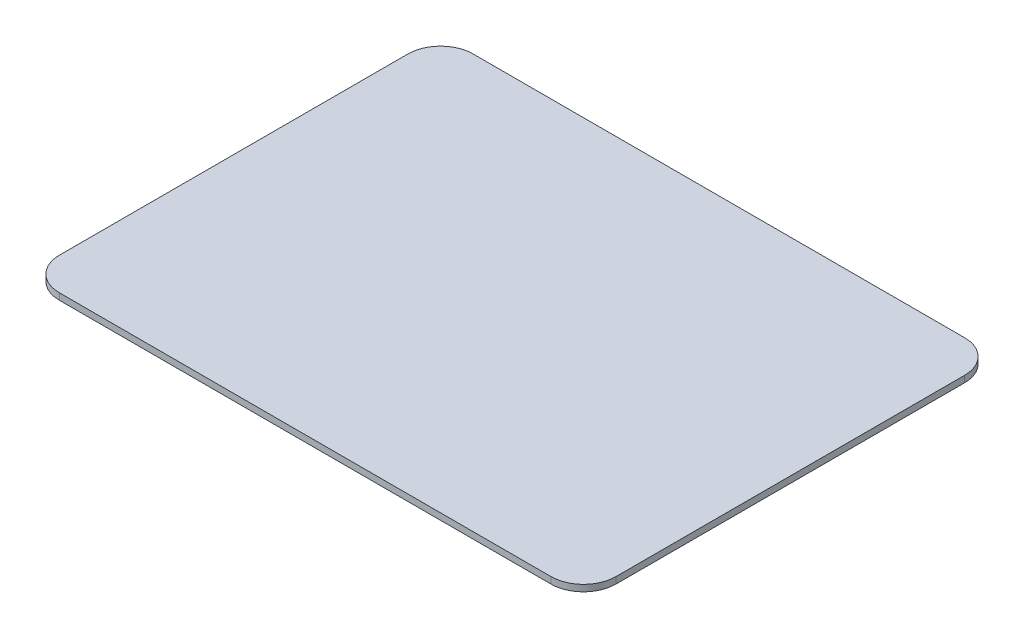
ISO-10303-21;
HEADER;
FILE_DESCRIPTION(('STEP AP214'),'2;1');
FILE_NAME('part.step','',(''),(''),'','','');
FILE_SCHEMA(('AUTOMOTIVE_DESIGN { 1 0 10303 214 1 1 1 1 }'));
ENDSEC;
DATA;
#1=APPLICATION_CONTEXT('core data for automotive mechanical design processes');
#2=APPLICATION_PROTOCOL_DEFINITION('international standard','automotive_design',2000,#1);
#3=PRODUCT_CONTEXT('',#1,'mechanical');
#4=PRODUCT('Part','Part','',(#3));
#5=PRODUCT_RELATED_PRODUCT_CATEGORY('part','',(#4));
#6=PRODUCT_DEFINITION_FORMATION('','',#4);
#7=PRODUCT_DEFINITION_CONTEXT('part definition',#1,'design');
#8=PRODUCT_DEFINITION('design','',#6,#7);
#9=PRODUCT_DEFINITION_SHAPE('','',#8);
#10=(LENGTH_UNIT() NAMED_UNIT(*) SI_UNIT(.MILLI.,.METRE.));
#11=(NAMED_UNIT(*) PLANE_ANGLE_UNIT() SI_UNIT($,.RADIAN.));
#12=(NAMED_UNIT(*) SI_UNIT($,.STERADIAN.) SOLID_ANGLE_UNIT());
#13=UNCERTAINTY_MEASURE_WITH_UNIT(LENGTH_MEASURE(1.E-05),#10,'distance_accuracy_value','');
#14=(GEOMETRIC_REPRESENTATION_CONTEXT(3) GLOBAL_UNCERTAINTY_ASSIGNED_CONTEXT((#13)) GLOBAL_UNIT_ASSIGNED_CONTEXT((#10,
#11,#12)) REPRESENTATION_CONTEXT('',''));
#15=CARTESIAN_POINT('',(0.,0.,0.));
#16=DIRECTION('',(0.,0.,1.));
#17=DIRECTION('',(1.,0.,0.));
#18=AXIS2_PLACEMENT_3D('',#15,#16,#17);
#19=CARTESIAN_POINT('',(20.9358973194442,3.,-141.27613784606));
#20=DIRECTION('',(1.,0.,0.));
#21=DIRECTION('',(0.,0.,-1.));
#22=AXIS2_PLACEMENT_3D('',#19,#20,#21);
#23=PLANE('',#22);
#24=DIRECTION('',(0.,0.,1.));
#25=VECTOR('',#24,1.);
#26=CARTESIAN_POINT('',(20.9358973194442,3.,-141.27613784606));
#27=LINE('',#26,#25);
#28=CARTESIAN_POINT('',(20.9358973194442,3.,-126.27613784606));
#29=VERTEX_POINT('',#28);
#30=CARTESIAN_POINT('',(20.9358973194442,3.,34.2559985482419));
#31=VERTEX_POINT('',#30);
#32=EDGE_CURVE('E130',#29,#31,#27,.T.);
#33=ORIENTED_EDGE('',*,*,#32,.F.);
#34=DIRECTION('',(0.,-1.,0.));
#35=VECTOR('',#34,1.);
#36=CARTESIAN_POINT('',(20.9358973194442,3.,-126.27613784606));
#37=LINE('',#36,#35);
#38=CARTESIAN_POINT('',(20.9358973194442,0.,-126.27613784606));
#39=VERTEX_POINT('',#38);
#40=EDGE_CURVE('E11',#29,#39,#37,.T.);
#41=ORIENTED_EDGE('',*,*,#40,.T.);
#42=DIRECTION('',(0.,0.,1.));
#43=VECTOR('',#42,1.);
#44=CARTESIAN_POINT('',(20.9358973194442,0.,-141.27613784606));
#45=LINE('',#44,#43);
#46=CARTESIAN_POINT('',(20.9358973194442,0.,34.2559985482419));
#47=VERTEX_POINT('',#46);
#48=EDGE_CURVE('E132',#39,#47,#45,.T.);
#49=ORIENTED_EDGE('',*,*,#48,.T.);
#50=DIRECTION('',(0.,-1.,0.));
#51=VECTOR('',#50,1.);
#52=CARTESIAN_POINT('',(20.9358973194442,3.,34.2559985482419));
#53=LINE('',#52,#51);
#54=EDGE_CURVE('E43',#47,#31,#53,.F.);
#55=ORIENTED_EDGE('',*,*,#54,.T.);
#56=EDGE_LOOP('',(#33,#41,#49,#55));
#57=FACE_BOUND('',#56,.T.);
#58=ADVANCED_FACE('F35',(#57),#23,.F.);
#59=CARTESIAN_POINT('',(20.9358973194442,3.,49.2559985482419));
#60=DIRECTION('',(0.,0.,-1.));
#61=DIRECTION('',(-1.,0.,0.));
#62=AXIS2_PLACEMENT_3D('',#59,#60,#61);
#63=PLANE('',#62);
#64=DIRECTION('',(1.,0.,0.));
#65=VECTOR('',#64,1.);
#66=CARTESIAN_POINT('',(20.9358973194442,0.,49.2559985482419));
#67=LINE('',#66,#65);
#68=CARTESIAN_POINT('',(35.9358973194442,0.,49.2559985482419));
#69=VERTEX_POINT('',#68);
#70=CARTESIAN_POINT('',(262.301771029212,0.,49.2559985482419));
#71=VERTEX_POINT('',#70);
#72=EDGE_CURVE('E128',#69,#71,#67,.T.);
#73=ORIENTED_EDGE('',*,*,#72,.T.);
#74=DIRECTION('',(0.,-1.,0.));
#75=VECTOR('',#74,1.);
#76=CARTESIAN_POINT('',(262.301771029212,3.,49.2559985482419));
#77=LINE('',#76,#75);
#78=CARTESIAN_POINT('',(262.301771029212,3.,49.2559985482419));
#79=VERTEX_POINT('',#78);
#80=EDGE_CURVE('E107',#71,#79,#77,.F.);
#81=ORIENTED_EDGE('',*,*,#80,.T.);
#82=DIRECTION('',(1.,0.,0.));
#83=VECTOR('',#82,1.);
#84=CARTESIAN_POINT('',(20.9358973194442,3.,49.2559985482419));
#85=LINE('',#84,#83);
#86=CARTESIAN_POINT('',(35.9358973194442,3.,49.2559985482419));
#87=VERTEX_POINT('',#86);
#88=EDGE_CURVE('E168',#87,#79,#85,.T.);
#89=ORIENTED_EDGE('',*,*,#88,.F.);
#90=DIRECTION('',(0.,-1.,0.));
#91=VECTOR('',#90,1.);
#92=CARTESIAN_POINT('',(35.9358973194442,3.,49.2559985482419));
#93=LINE('',#92,#91);
#94=EDGE_CURVE('E112',#87,#69,#93,.T.);
#95=ORIENTED_EDGE('',*,*,#94,.T.);
#96=EDGE_LOOP('',(#73,#81,#89,#95));
#97=FACE_BOUND('',#96,.T.);
#98=ADVANCED_FACE('F172',(#97),#63,.F.);
#99=CARTESIAN_POINT('',(277.301771029212,3.,-141.27613784606));
#100=DIRECTION('',(-1.,0.,0.));
#101=DIRECTION('',(0.,0.,1.));
#102=AXIS2_PLACEMENT_3D('',#99,#100,#101);
#103=PLANE('',#102);
#104=DIRECTION('',(0.,0.,-1.));
#105=VECTOR('',#104,1.);
#106=CARTESIAN_POINT('',(277.301771029212,3.,-141.27613784606));
#107=LINE('',#106,#105);
#108=CARTESIAN_POINT('',(277.301771029212,3.,34.2559985482419));
#109=VERTEX_POINT('',#108);
#110=CARTESIAN_POINT('',(277.301771029212,3.,-126.27613784606));
#111=VERTEX_POINT('',#110);
#112=EDGE_CURVE('E121',#109,#111,#107,.T.);
#113=ORIENTED_EDGE('',*,*,#112,.F.);
#114=DIRECTION('',(0.,-1.,0.));
#115=VECTOR('',#114,1.);
#116=CARTESIAN_POINT('',(277.301771029212,3.,34.2559985482419));
#117=LINE('',#116,#115);
#118=CARTESIAN_POINT('',(277.301771029212,0.,34.2559985482419));
#119=VERTEX_POINT('',#118);
#120=EDGE_CURVE('E106',#109,#119,#117,.T.);
#121=ORIENTED_EDGE('',*,*,#120,.T.);
#122=DIRECTION('',(0.,0.,-1.));
#123=VECTOR('',#122,1.);
#124=CARTESIAN_POINT('',(277.301771029212,0.,-141.27613784606));
#125=LINE('',#124,#123);
#126=CARTESIAN_POINT('',(277.301771029212,0.,-126.27613784606));
#127=VERTEX_POINT('',#126);
#128=EDGE_CURVE('E119',#119,#127,#125,.T.);
#129=ORIENTED_EDGE('',*,*,#128,.T.);
#130=DIRECTION('',(0.,-1.,0.));
#131=VECTOR('',#130,1.);
#132=CARTESIAN_POINT('',(277.301771029212,3.,-126.27613784606));
#133=LINE('',#132,#131);
#134=EDGE_CURVE('E123',#127,#111,#133,.F.);
#135=ORIENTED_EDGE('',*,*,#134,.T.);
#136=EDGE_LOOP('',(#113,#121,#129,#135));
#137=FACE_BOUND('',#136,.T.);
#138=ADVANCED_FACE('F118',(#137),#103,.F.);
#139=CARTESIAN_POINT('',(20.9358973194442,3.,-141.27613784606));
#140=DIRECTION('',(0.,0.,1.));
#141=DIRECTION('',(1.,0.,0.));
#142=AXIS2_PLACEMENT_3D('',#139,#140,#141);
#143=PLANE('',#142);
#144=DIRECTION('',(-1.,0.,0.));
#145=VECTOR('',#144,1.);
#146=CARTESIAN_POINT('',(20.9358973194442,3.,-141.27613784606));
#147=LINE('',#146,#145);
#148=CARTESIAN_POINT('',(262.301771029212,3.,-141.27613784606));
#149=VERTEX_POINT('',#148);
#150=CARTESIAN_POINT('',(35.9358973194442,3.,-141.27613784606));
#151=VERTEX_POINT('',#150);
#152=EDGE_CURVE('E136',#149,#151,#147,.T.);
#153=ORIENTED_EDGE('',*,*,#152,.F.);
#154=DIRECTION('',(0.,-1.,0.));
#155=VECTOR('',#154,1.);
#156=CARTESIAN_POINT('',(262.301771029212,3.,-141.27613784606));
#157=LINE('',#156,#155);
#158=CARTESIAN_POINT('',(262.301771029212,0.,-141.27613784606));
#159=VERTEX_POINT('',#158);
#160=EDGE_CURVE('E153',#149,#159,#157,.T.);
#161=ORIENTED_EDGE('',*,*,#160,.T.);
#162=DIRECTION('',(-1.,0.,0.));
#163=VECTOR('',#162,1.);
#164=CARTESIAN_POINT('',(20.9358973194442,0.,-141.27613784606));
#165=LINE('',#164,#163);
#166=CARTESIAN_POINT('',(35.9358973194442,0.,-141.27613784606));
#167=VERTEX_POINT('',#166);
#168=EDGE_CURVE('E127',#159,#167,#165,.T.);
#169=ORIENTED_EDGE('',*,*,#168,.T.);
#170=DIRECTION('',(0.,-1.,0.));
#171=VECTOR('',#170,1.);
#172=CARTESIAN_POINT('',(35.9358973194442,3.,-141.27613784606));
#173=LINE('',#172,#171);
#174=EDGE_CURVE('E50',#167,#151,#173,.F.);
#175=ORIENTED_EDGE('',*,*,#174,.T.);
#176=EDGE_LOOP('',(#153,#161,#169,#175));
#177=FACE_BOUND('',#176,.T.);
#178=ADVANCED_FACE('F179',(#177),#143,.F.);
#179=CARTESIAN_POINT('',(0.,3.,0.));
#180=DIRECTION('',(0.,1.,0.));
#181=DIRECTION('',(0.,0.,1.));
#182=AXIS2_PLACEMENT_3D('',#179,#180,#181);
#183=PLANE('',#182);
#184=ORIENTED_EDGE('',*,*,#88,.T.);
#185=CARTESIAN_POINT('',(262.301771029212,3.,34.2559985482419));
#186=DIRECTION('',(0.,1.,0.));
#187=DIRECTION('',(0.,0.,1.));
#188=AXIS2_PLACEMENT_3D('',#185,#186,#187);
#189=CIRCLE('',#188,15.);
#190=EDGE_CURVE('E150',#79,#109,#189,.T.);
#191=ORIENTED_EDGE('',*,*,#190,.T.);
#192=ORIENTED_EDGE('',*,*,#112,.T.);
#193=CARTESIAN_POINT('',(262.301771029212,3.,-126.27613784606));
#194=DIRECTION('',(0.,1.,0.));
#195=DIRECTION('',(0.,0.,1.));
#196=AXIS2_PLACEMENT_3D('',#193,#194,#195);
#197=CIRCLE('',#196,15.);
#198=EDGE_CURVE('E57',#111,#149,#197,.T.);
#199=ORIENTED_EDGE('',*,*,#198,.T.);
#200=ORIENTED_EDGE('',*,*,#152,.T.);
#201=CARTESIAN_POINT('',(35.9358973194442,3.,-126.27613784606));
#202=DIRECTION('',(0.,1.,0.));
#203=DIRECTION('',(0.,0.,1.));
#204=AXIS2_PLACEMENT_3D('',#201,#202,#203);
#205=CIRCLE('',#204,15.);
#206=EDGE_CURVE('E147',#151,#29,#205,.T.);
#207=ORIENTED_EDGE('',*,*,#206,.T.);
#208=ORIENTED_EDGE('',*,*,#32,.T.);
#209=CARTESIAN_POINT('',(35.9358973194442,3.,34.2559985482419));
#210=DIRECTION('',(0.,1.,0.));
#211=DIRECTION('',(0.,0.,1.));
#212=AXIS2_PLACEMENT_3D('',#209,#210,#211);
#213=CIRCLE('',#212,15.);
#214=EDGE_CURVE('E145',#31,#87,#213,.T.);
#215=ORIENTED_EDGE('',*,*,#214,.T.);
#216=EDGE_LOOP('',(#184,#191,#192,#199,#200,#207,#208,#215));
#217=FACE_BOUND('',#216,.T.);
#218=ADVANCED_FACE('F165',(#217),#183,.T.);
#219=CARTESIAN_POINT('',(0.,0.,0.));
#220=DIRECTION('',(0.,1.,0.));
#221=DIRECTION('',(0.,0.,1.));
#222=AXIS2_PLACEMENT_3D('',#219,#220,#221);
#223=PLANE('',#222);
#224=ORIENTED_EDGE('',*,*,#128,.F.);
#225=CARTESIAN_POINT('',(262.301771029212,0.,34.2559985482419));
#226=DIRECTION('',(0.,1.,0.));
#227=DIRECTION('',(0.,0.,1.));
#228=AXIS2_PLACEMENT_3D('',#225,#226,#227);
#229=CIRCLE('',#228,15.);
#230=EDGE_CURVE('E102',#119,#71,#229,.F.);
#231=ORIENTED_EDGE('',*,*,#230,.T.);
#232=ORIENTED_EDGE('',*,*,#72,.F.);
#233=CARTESIAN_POINT('',(35.9358973194442,0.,34.2559985482419));
#234=DIRECTION('',(0.,1.,0.));
#235=DIRECTION('',(0.,0.,1.));
#236=AXIS2_PLACEMENT_3D('',#233,#234,#235);
#237=CIRCLE('',#236,15.);
#238=EDGE_CURVE('E122',#69,#47,#237,.F.);
#239=ORIENTED_EDGE('',*,*,#238,.T.);
#240=ORIENTED_EDGE('',*,*,#48,.F.);
#241=CARTESIAN_POINT('',(35.9358973194442,0.,-126.27613784606));
#242=DIRECTION('',(0.,1.,0.));
#243=DIRECTION('',(0.,0.,1.));
#244=AXIS2_PLACEMENT_3D('',#241,#242,#243);
#245=CIRCLE('',#244,15.);
#246=EDGE_CURVE('E139',#39,#167,#245,.F.);
#247=ORIENTED_EDGE('',*,*,#246,.T.);
#248=ORIENTED_EDGE('',*,*,#168,.F.);
#249=CARTESIAN_POINT('',(262.301771029212,0.,-126.27613784606));
#250=DIRECTION('',(0.,1.,0.));
#251=DIRECTION('',(0.,0.,1.));
#252=AXIS2_PLACEMENT_3D('',#249,#250,#251);
#253=CIRCLE('',#252,15.);
#254=EDGE_CURVE('E113',#159,#127,#253,.F.);
#255=ORIENTED_EDGE('',*,*,#254,.T.);
#256=EDGE_LOOP('',(#224,#231,#232,#239,#240,#247,#248,#255));
#257=FACE_BOUND('',#256,.T.);
#258=ADVANCED_FACE('F125',(#257),#223,.F.);
#259=CARTESIAN_POINT('',(262.301771029212,3.,34.2559985482419));
#260=DIRECTION('',(0.,-1.,0.));
#261=DIRECTION('',(0.,0.,-1.));
#262=AXIS2_PLACEMENT_3D('',#259,#260,#261);
#263=CYLINDRICAL_SURFACE('',#262,15.);
#264=ORIENTED_EDGE('',*,*,#190,.F.);
#265=ORIENTED_EDGE('',*,*,#80,.F.);
#266=ORIENTED_EDGE('',*,*,#230,.F.);
#267=ORIENTED_EDGE('',*,*,#120,.F.);
#268=EDGE_LOOP('',(#264,#265,#266,#267));
#269=FACE_BOUND('',#268,.T.);
#270=ADVANCED_FACE('F105',(#269),#263,.T.);
#271=CARTESIAN_POINT('',(262.301771029212,3.,-126.27613784606));
#272=DIRECTION('',(0.,-1.,0.));
#273=DIRECTION('',(0.,0.,-1.));
#274=AXIS2_PLACEMENT_3D('',#271,#272,#273);
#275=CYLINDRICAL_SURFACE('',#274,15.);
#276=ORIENTED_EDGE('',*,*,#198,.F.);
#277=ORIENTED_EDGE('',*,*,#134,.F.);
#278=ORIENTED_EDGE('',*,*,#254,.F.);
#279=ORIENTED_EDGE('',*,*,#160,.F.);
#280=EDGE_LOOP('',(#276,#277,#278,#279));
#281=FACE_BOUND('',#280,.T.);
#282=ADVANCED_FACE('F178',(#281),#275,.T.);
#283=CARTESIAN_POINT('',(35.9358973194442,3.,-126.27613784606));
#284=DIRECTION('',(0.,-1.,0.));
#285=DIRECTION('',(0.,0.,-1.));
#286=AXIS2_PLACEMENT_3D('',#283,#284,#285);
#287=CYLINDRICAL_SURFACE('',#286,15.);
#288=ORIENTED_EDGE('',*,*,#206,.F.);
#289=ORIENTED_EDGE('',*,*,#174,.F.);
#290=ORIENTED_EDGE('',*,*,#246,.F.);
#291=ORIENTED_EDGE('',*,*,#40,.F.);
#292=EDGE_LOOP('',(#288,#289,#290,#291));
#293=FACE_BOUND('',#292,.T.);
#294=ADVANCED_FACE('F181',(#293),#287,.T.);
#295=CARTESIAN_POINT('',(35.9358973194442,3.,34.2559985482419));
#296=DIRECTION('',(0.,-1.,0.));
#297=DIRECTION('',(0.,0.,-1.));
#298=AXIS2_PLACEMENT_3D('',#295,#296,#297);
#299=CYLINDRICAL_SURFACE('',#298,15.);
#300=ORIENTED_EDGE('',*,*,#214,.F.);
#301=ORIENTED_EDGE('',*,*,#54,.F.);
#302=ORIENTED_EDGE('',*,*,#238,.F.);
#303=ORIENTED_EDGE('',*,*,#94,.F.);
#304=EDGE_LOOP('',(#300,#301,#302,#303));
#305=FACE_BOUND('',#304,.T.);
#306=ADVANCED_FACE('F37',(#305),#299,.T.);
#307=CLOSED_SHELL('',(#58,#98,#138,#178,#218,#258,#270,#282,#294,#306));
#308=MANIFOLD_SOLID_BREP('B2',#307);
#309=ADVANCED_BREP_SHAPE_REPRESENTATION('',(#18,#308),#14);
#310=SHAPE_DEFINITION_REPRESENTATION(#9,#309);
ENDSEC;
END-ISO-10303-21;
